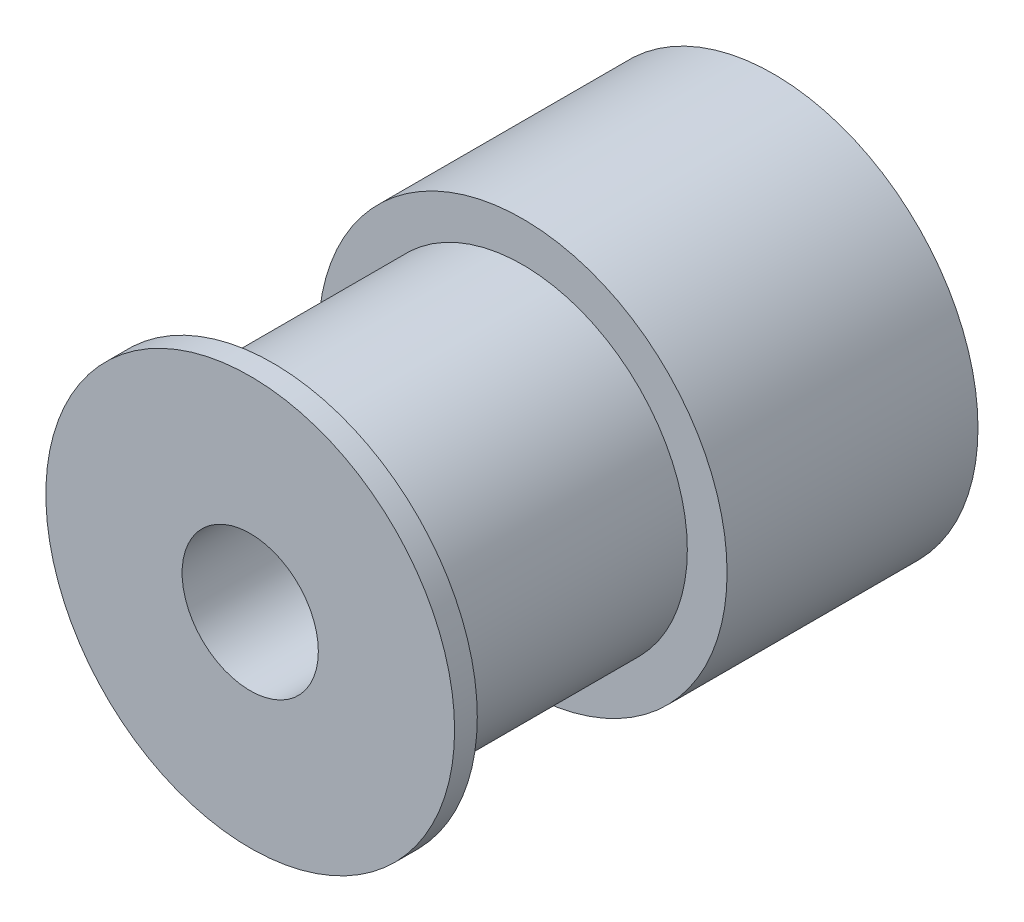
ISO-10303-21;
HEADER;
FILE_DESCRIPTION(('STEP AP214'),'2;1');
FILE_NAME('part.step','',(''),(''),'','','');
FILE_SCHEMA(('AUTOMOTIVE_DESIGN { 1 0 10303 214 1 1 1 1 }'));
ENDSEC;
DATA;
#1=APPLICATION_CONTEXT('core data for automotive mechanical design processes');
#2=APPLICATION_PROTOCOL_DEFINITION('international standard','automotive_design',2000,#1);
#3=PRODUCT_CONTEXT('',#1,'mechanical');
#4=PRODUCT('Part','Part','',(#3));
#5=PRODUCT_RELATED_PRODUCT_CATEGORY('part','',(#4));
#6=PRODUCT_DEFINITION_FORMATION('','',#4);
#7=PRODUCT_DEFINITION_CONTEXT('part definition',#1,'design');
#8=PRODUCT_DEFINITION('design','',#6,#7);
#9=PRODUCT_DEFINITION_SHAPE('','',#8);
#10=(LENGTH_UNIT() NAMED_UNIT(*) SI_UNIT(.MILLI.,.METRE.));
#11=(NAMED_UNIT(*) PLANE_ANGLE_UNIT() SI_UNIT($,.RADIAN.));
#12=(NAMED_UNIT(*) SI_UNIT($,.STERADIAN.) SOLID_ANGLE_UNIT());
#13=UNCERTAINTY_MEASURE_WITH_UNIT(LENGTH_MEASURE(1.E-05),#10,'distance_accuracy_value','');
#14=(GEOMETRIC_REPRESENTATION_CONTEXT(3) GLOBAL_UNCERTAINTY_ASSIGNED_CONTEXT((#13)) GLOBAL_UNIT_ASSIGNED_CONTEXT((#10,
#11,#12)) REPRESENTATION_CONTEXT('',''));
#15=CARTESIAN_POINT('',(0.,0.,0.));
#16=DIRECTION('',(0.,0.,1.));
#17=DIRECTION('',(1.,0.,0.));
#18=AXIS2_PLACEMENT_3D('',#15,#16,#17);
#19=CARTESIAN_POINT('',(-7.6576224925767E-07,0.0303759794272524,10.7364688875642));
#20=DIRECTION('',(0.,0.,1.));
#21=DIRECTION('',(1.,0.,0.));
#22=AXIS2_PLACEMENT_3D('',#19,#20,#21);
#23=PLANE('',#22);
#24=CARTESIAN_POINT('',(-7.6576224925767E-07,0.0303759794272524,10.7364688875642));
#25=DIRECTION('',(0.,0.,1.));
#26=DIRECTION('',(1.,0.,0.));
#27=AXIS2_PLACEMENT_3D('',#24,#25,#26);
#28=CIRCLE('',#27,3.625);
#29=CARTESIAN_POINT('',(3.62499923423775,0.0303759794272524,10.7364688875642));
#30=VERTEX_POINT('',#29);
#31=EDGE_CURVE('E12',#30,#30,#28,.T.);
#32=ORIENTED_EDGE('',*,*,#31,.F.);
#33=EDGE_LOOP('',(#32));
#34=FACE_BOUND('',#33,.T.);
#35=CARTESIAN_POINT('',(-7.6576224925767E-07,0.0303759794272524,10.7364688875642));
#36=DIRECTION('',(0.,0.,1.));
#37=DIRECTION('',(1.,0.,0.));
#38=AXIS2_PLACEMENT_3D('',#35,#36,#37);
#39=CIRCLE('',#38,4.5);
#40=CARTESIAN_POINT('',(4.49999923423775,0.0303759794272524,10.7364688875642));
#41=VERTEX_POINT('',#40);
#42=EDGE_CURVE('E59',#41,#41,#39,.T.);
#43=ORIENTED_EDGE('',*,*,#42,.T.);
#44=EDGE_LOOP('',(#43));
#45=FACE_BOUND('',#44,.T.);
#46=ADVANCED_FACE('F45',(#34,#45),#23,.T.);
#47=CARTESIAN_POINT('',(-7.6576224925767E-07,0.0303759794272524,5.21146888756417));
#48=DIRECTION('',(0.,0.,1.));
#49=DIRECTION('',(1.,0.,0.));
#50=AXIS2_PLACEMENT_3D('',#47,#48,#49);
#51=PLANE('',#50);
#52=CARTESIAN_POINT('',(-7.6576224925767E-07,0.0303759794272524,5.21146888756417));
#53=DIRECTION('',(0.,0.,1.));
#54=DIRECTION('',(1.,0.,0.));
#55=AXIS2_PLACEMENT_3D('',#52,#53,#54);
#56=CIRCLE('',#55,4.5);
#57=CARTESIAN_POINT('',(4.49999923423775,0.0303759794272524,5.21146888756417));
#58=VERTEX_POINT('',#57);
#59=EDGE_CURVE('E64',#58,#58,#56,.T.);
#60=ORIENTED_EDGE('',*,*,#59,.F.);
#61=EDGE_LOOP('',(#60));
#62=FACE_BOUND('',#61,.T.);
#63=CARTESIAN_POINT('',(-7.6576224925767E-07,0.0303759794272524,5.21146888756417));
#64=DIRECTION('',(0.,0.,1.));
#65=DIRECTION('',(1.,0.,0.));
#66=AXIS2_PLACEMENT_3D('',#63,#64,#65);
#67=CIRCLE('',#66,1.5);
#68=CARTESIAN_POINT('',(1.49999923423775,0.0303759794272524,5.21146888756417));
#69=VERTEX_POINT('',#68);
#70=EDGE_CURVE('E70',#69,#69,#67,.T.);
#71=ORIENTED_EDGE('',*,*,#70,.T.);
#72=EDGE_LOOP('',(#71));
#73=FACE_BOUND('',#72,.T.);
#74=ADVANCED_FACE('F76',(#62,#73),#51,.F.);
#75=CARTESIAN_POINT('',(-7.6576224925767E-07,0.0303759794272524,10.7364688875642));
#76=DIRECTION('',(0.,0.,-1.));
#77=DIRECTION('',(-1.,0.,0.));
#78=AXIS2_PLACEMENT_3D('',#75,#76,#77);
#79=CYLINDRICAL_SURFACE('',#78,4.5);
#80=CARTESIAN_POINT('',(-7.6576224925767E-07,-4.46962402057275,7.96146888756417));
#81=CARTESIAN_POINT('',(0.0418165057252151,-4.46962330407922,7.96146721087982));
#82=CARTESIAN_POINT('',(0.0836565987893969,-4.46903505431185,7.95795970507349));
#83=CARTESIAN_POINT('',(0.166163300739664,-4.46674505539691,7.94402818993457));
#84=CARTESIAN_POINT('',(0.206828794625525,-4.46504228234442,7.93359782049068));
#85=CARTESIAN_POINT('',(0.285780658401544,-4.4607142252821,7.90614425298634));
#86=CARTESIAN_POINT('',(0.324068944767321,-4.45808969605033,7.88912644787199));
#87=CARTESIAN_POINT('',(0.397241786831134,-4.45220670181896,7.84899519994845));
#88=CARTESIAN_POINT('',(0.432126731201328,-4.44894830933605,7.82588245431927));
#89=CARTESIAN_POINT('',(0.497841018525255,-4.44212397294769,7.77398236241803));
#90=CARTESIAN_POINT('',(0.528633105298241,-4.43855563601732,7.74514815317333));
#91=CARTESIAN_POINT('',(0.584965783835729,-4.43153190120294,7.68272449702232));
#92=CARTESIAN_POINT('',(0.610506044055042,-4.42807651046075,7.64913475012718));
#93=CARTESIAN_POINT('',(0.655759371919291,-4.42164671785209,7.57789759770505));
#94=CARTESIAN_POINT('',(0.675435600096051,-4.41867540784766,7.54022648652274));
#95=CARTESIAN_POINT('',(0.708166743861116,-4.41358338995677,7.46205601827398));
#96=CARTESIAN_POINT('',(0.721222106707435,-4.41146262461567,7.42155685246088));
#97=CARTESIAN_POINT('',(0.740223547573193,-4.40833563110101,7.33927480510721));
#98=CARTESIAN_POINT('',(0.746233942978371,-4.40731932602985,7.29750716661375));
#99=CARTESIAN_POINT('',(0.751174251824713,-4.4064858373827,7.21354480449913));
#100=CARTESIAN_POINT('',(0.75010466635445,-4.40666856894439,7.17135011131398));
#101=CARTESIAN_POINT('',(0.740967763756596,-4.40820330716341,7.08819052918153));
#102=CARTESIAN_POINT('',(0.732972698804683,-4.4095432405295,7.0472174465006));
#103=CARTESIAN_POINT('',(0.710325176358784,-4.41322250620577,6.96720249221543));
#104=CARTESIAN_POINT('',(0.695672490533673,-4.41556187279256,6.9281606868976));
#105=CARTESIAN_POINT('',(0.660052408065924,-4.42098945857505,6.85290024053189));
#106=CARTESIAN_POINT('',(0.639055008401665,-4.42408122189472,6.8166960657398));
#107=CARTESIAN_POINT('',(0.591362839504981,-4.43066277581777,6.74829756740265));
#108=CARTESIAN_POINT('',(0.564667610434037,-4.43415259853561,6.71610356782769));
#109=CARTESIAN_POINT('',(0.505943897885467,-4.4411901042121,6.65622106182196));
#110=CARTESIAN_POINT('',(0.473853423399689,-4.4447379682677,6.62859333200214));
#111=CARTESIAN_POINT('',(0.405459808932244,-4.45145182476292,6.57910555876456));
#112=CARTESIAN_POINT('',(0.369156641809677,-4.45461781474198,6.5572455525092));
#113=CARTESIAN_POINT('',(0.293311009087764,-4.46021569925148,6.51990821942328));
#114=CARTESIAN_POINT('',(0.253765851907149,-4.46264697579509,6.50443626176479));
#115=CARTESIAN_POINT('',(0.17258873791857,-4.46649652961073,6.48037062299037));
#116=CARTESIAN_POINT('',(0.130956955991591,-4.46791489162417,6.47177636647205));
#117=CARTESIAN_POINT('',(0.0473122046282373,-4.46956741010081,6.46179248002583));
#118=CARTESIAN_POINT('',(0.00530945538305355,-4.4698152796111,6.46031941602249));
#119=CARTESIAN_POINT('',(-0.078342697629216,-4.46913644383626,6.4643972908926));
#120=CARTESIAN_POINT('',(-0.119992114929861,-4.4682097837451,6.46994795950429));
#121=CARTESIAN_POINT('',(-0.201497618426279,-4.46529450138735,6.48784634236481));
#122=CARTESIAN_POINT('',(-0.241363026277864,-4.46331233497668,6.5001527500812));
#123=CARTESIAN_POINT('',(-0.318464831220383,-4.45850741393882,6.53116924302403));
#124=CARTESIAN_POINT('',(-0.355701080535165,-4.45568461210881,6.54987968785475));
#125=CARTESIAN_POINT('',(-0.426849972602937,-4.44947756947997,6.5933642249732));
#126=CARTESIAN_POINT('',(-0.460730341043394,-4.44608858823381,6.61819043441434));
#127=CARTESIAN_POINT('',(-0.523873841413056,-4.43913942274845,6.67313008217968));
#128=CARTESIAN_POINT('',(-0.553136637671225,-4.43557922608739,6.70324390454717));
#129=CARTESIAN_POINT('',(-0.60652359965965,-4.42864454628028,6.76827815198559));
#130=CARTESIAN_POINT('',(-0.630591394096364,-4.42527236898407,6.80324513721849));
#131=CARTESIAN_POINT('',(-0.672511458850745,-4.4191386099064,6.87677477830573));
#132=CARTESIAN_POINT('',(-0.690363926193196,-4.41637700877081,6.91533732013242));
#133=CARTESIAN_POINT('',(-0.719262265204194,-4.41179438166586,6.99480580740781));
#134=CARTESIAN_POINT('',(-0.730336195526633,-4.40996948350594,7.03570131607332));
#135=CARTESIAN_POINT('',(-0.745451401895733,-4.40745717107853,7.1188049263307));
#136=CARTESIAN_POINT('',(-0.7494932893461,-4.40676965792091,7.16101291348378));
#137=CARTESIAN_POINT('',(-0.750412625576455,-4.40661421982478,7.24498043735289));
#138=CARTESIAN_POINT('',(-0.747378806599805,-4.4071311900897,7.28673900113675));
#139=CARTESIAN_POINT('',(-0.734424717449304,-4.40929336493393,7.3691426619794));
#140=CARTESIAN_POINT('',(-0.724504469595992,-4.41093856585639,7.40978776264673));
#141=CARTESIAN_POINT('',(-0.698093112640719,-4.4151660894179,7.48877641875195));
#142=CARTESIAN_POINT('',(-0.681609642942382,-4.41774732223176,7.52712259058097));
#143=CARTESIAN_POINT('',(-0.642548866937022,-4.42355712733937,7.60051958832262));
#144=CARTESIAN_POINT('',(-0.619971258386818,-4.42678573173795,7.63557025067581));
#145=CARTESIAN_POINT('',(-0.569046431073895,-4.43357438270961,7.70182956249649));
#146=CARTESIAN_POINT('',(-0.540633934840343,-4.43713790730166,7.73298769257425));
#147=CARTESIAN_POINT('',(-0.478983475176317,-4.44416713765527,7.79012436890665));
#148=CARTESIAN_POINT('',(-0.44574439963604,-4.44763282065239,7.81610171815562));
#149=CARTESIAN_POINT('',(-0.375111516654333,-4.45410360949941,7.86230336802415));
#150=CARTESIAN_POINT('',(-0.337690602022094,-4.45710536933206,7.88248669935805));
#151=CARTESIAN_POINT('',(-0.259954686575943,-4.46227752337807,7.91624973294714));
#152=CARTESIAN_POINT('',(-0.219642614211252,-4.46444874510519,7.92983601188808));
#153=CARTESIAN_POINT('',(-0.149311758775869,-4.46724139307161,7.94707046980217));
#154=CARTESIAN_POINT('',(-0.119718414851783,-4.46813010239282,7.95246122844896));
#155=CARTESIAN_POINT('',(-0.0600875588581919,-4.46932166853111,7.95966100891759));
#156=CARTESIAN_POINT('',(-0.0300500544447975,-4.46962453543467,7.96147009240538));
#157=CARTESIAN_POINT('',(-7.6576224925767E-07,-4.46962402057275,7.96146888756417));
#158=B_SPLINE_CURVE_WITH_KNOTS('',3,(#80,#81,#82,#83,#84,#85,#86,#87,#88,#89,#90,#91,#92,#93,
#94,#95,#96,#97,#98,#99,#100,#101,#102,#103,#104,#105,#106,#107,#108,#109,#110,#111,#112,#113,
#114,#115,#116,#117,#118,#119,#120,#121,#122,#123,#124,#125,#126,#127,#128,#129,#130,#131,#132,
#133,#134,#135,#136,#137,#138,#139,#140,#141,#142,#143,#144,#145,#146,#147,#148,#149,#150,#151,
#152,#153,#154,#155,#156,#157),.UNSPECIFIED.,.T.,.F.,(4,2,2,2,2,2,2,2,2,2,2,2,2,2,2,2,2,2,2,2,2,
2,2,2,2,2,2,2,2,2,2,2,2,2,2,2,2,2,4),(0.,0.125341975481553,0.250799263708626,0.376154060107581,
0.501494523802437,0.627907473186997,0.75432840050957,0.88152756247152,1.00871813062854,
1.13473823131027,1.26074941296266,1.38546156528123,1.51017799507614,1.63549366989767,
1.76081946204172,1.88769830973398,2.01457797490754,2.14156406674771,2.26853953356345,
2.39402365047419,2.51950293910758,2.64422342101925,2.7689509074782,2.89478047688107,
3.02061918916285,3.14776146602286,3.27489971212783,3.40150806702532,3.52810541335985,
3.6531237285681,3.7781416385644,3.90301445467867,4.02789346508801,4.15425415258018,
4.28064400163692,4.4079066948216,4.53504225639022,4.62511274449205,4.7151816818309),.UNSPECIFIED.);
#159=CARTESIAN_POINT('',(-7.6576224925767E-07,-4.46962402057275,7.96146888756417));
#160=VERTEX_POINT('',#159);
#161=EDGE_CURVE('E91',#160,#160,#158,.T.);
#162=ORIENTED_EDGE('',*,*,#161,.T.);
#163=EDGE_LOOP('',(#162));
#164=FACE_BOUND('',#163,.T.);
#165=ORIENTED_EDGE('',*,*,#42,.F.);
#166=EDGE_LOOP('',(#165));
#167=FACE_BOUND('',#166,.T.);
#168=ORIENTED_EDGE('',*,*,#59,.T.);
#169=EDGE_LOOP('',(#168));
#170=FACE_BOUND('',#169,.T.);
#171=ADVANCED_FACE('F47',(#164,#167,#170),#79,.T.);
#172=CARTESIAN_POINT('',(-7.6576224925767E-07,0.0303759794272524,10.7364688875642));
#173=DIRECTION('',(0.,0.,-1.));
#174=DIRECTION('',(-1.,0.,0.));
#175=AXIS2_PLACEMENT_3D('',#172,#173,#174);
#176=CYLINDRICAL_SURFACE('',#175,1.5);
#177=CARTESIAN_POINT('',(-7.6576224925767E-07,-1.46962402057275,7.96146888756417));
#178=CARTESIAN_POINT('',(0.0394282064524905,-1.46962187110388,7.96146641082454));
#179=CARTESIAN_POINT('',(0.078904184011275,-1.46805270321913,7.95834133272291));
#180=CARTESIAN_POINT('',(0.156689410689069,-1.46193019085322,7.94597922730848));
#181=CARTESIAN_POINT('',(0.194996299272878,-1.45737117929012,7.93673059281593));
#182=CARTESIAN_POINT('',(0.269199392898182,-1.44574611609758,7.91257353110157));
#183=CARTESIAN_POINT('',(0.305104336442136,-1.43868981440415,7.89768709937816));
#184=CARTESIAN_POINT('',(0.373853696842675,-1.42271734444109,7.86279092154046));
#185=CARTESIAN_POINT('',(0.406698354730288,-1.41380132282422,7.84278157937753));
#186=CARTESIAN_POINT('',(0.47063009755919,-1.39429595750818,7.79683095045019));
#187=CARTESIAN_POINT('',(0.501490642579335,-1.38363801402927,7.77060402813443));
#188=CARTESIAN_POINT('',(0.558583817887984,-1.36207379742333,7.71357777812889));
#189=CARTESIAN_POINT('',(0.584812921567825,-1.35116734214051,7.68277499873484));
#190=CARTESIAN_POINT('',(0.633938234575459,-1.32936615455285,7.61460637542163));
#191=CARTESIAN_POINT('',(0.656418235901478,-1.31853792284874,7.57691681380473));
#192=CARTESIAN_POINT('',(0.694625404405772,-1.29926886136515,7.49769338557451));
#193=CARTESIAN_POINT('',(0.710357395462501,-1.29082632762517,7.45616229102211));
#194=CARTESIAN_POINT('',(0.733598565879192,-1.27805802335631,7.37297005849773));
#195=CARTESIAN_POINT('',(0.741543627048081,-1.2735160574506,7.33146554851362));
#196=CARTESIAN_POINT('',(0.750319479219385,-1.26848819518671,7.24748475922956));
#197=CARTESIAN_POINT('',(0.751157300517556,-1.26799829064741,7.2050094819108));
#198=CARTESIAN_POINT('',(0.746014699616972,-1.27095599750211,7.12575436932764));
#199=CARTESIAN_POINT('',(0.740837653890367,-1.27393974803785,7.08890086414688));
#200=CARTESIAN_POINT('',(0.72520412103045,-1.28269573607662,7.01667745553438));
#201=CARTESIAN_POINT('',(0.714745952160989,-1.28846886181107,6.98130802858518));
#202=CARTESIAN_POINT('',(0.688656569527253,-1.30228009366831,6.91204703813992));
#203=CARTESIAN_POINT('',(0.672910534574747,-1.31036782555274,6.87820908847483));
#204=CARTESIAN_POINT('',(0.636780499988752,-1.32789955268328,6.81349316812166));
#205=CARTESIAN_POINT('',(0.616394417097101,-1.33734415642418,6.7826165358641));
#206=CARTESIAN_POINT('',(0.568548775422342,-1.35797270484739,6.72057794800675));
#207=CARTESIAN_POINT('',(0.540520078014712,-1.36922534734834,6.68987623238205));
#208=CARTESIAN_POINT('',(0.479665918293781,-1.3912311953258,6.63341732362099));
#209=CARTESIAN_POINT('',(0.446838176668465,-1.40198416026375,6.60766249353876));
#210=CARTESIAN_POINT('',(0.375386613611637,-1.42238892519498,6.56070464179187));
#211=CARTESIAN_POINT('',(0.336564427937307,-1.4319664017878,6.53976853322986));
#212=CARTESIAN_POINT('',(0.255348895854349,-1.44830812898206,6.50489611578191));
#213=CARTESIAN_POINT('',(0.212958416436708,-1.45507461264939,6.49095424880279));
#214=CARTESIAN_POINT('',(0.129574102983277,-1.46455652363352,6.47161233477666));
#215=CARTESIAN_POINT('',(0.0887553821489938,-1.46756105783259,6.46560046075408));
#216=CARTESIAN_POINT('',(0.00658393419976601,-1.47017162151601,6.4603703392133));
#217=CARTESIAN_POINT('',(-0.0347685306646752,-1.46977926098259,6.46114887333456));
#218=CARTESIAN_POINT('',(-0.113425494751744,-1.46580796247355,6.46912390387823));
#219=CARTESIAN_POINT('',(-0.150795321799715,-1.46247836323417,6.47581828711169));
#220=CARTESIAN_POINT('',(-0.223805934988687,-1.45329030543389,6.49464744148548));
#221=CARTESIAN_POINT('',(-0.259446530030497,-1.44743156808024,6.50678281240419));
#222=CARTESIAN_POINT('',(-0.329167222099498,-1.43350590617527,6.53646773738905));
#223=CARTESIAN_POINT('',(-0.363173563516865,-1.42538063384729,6.55416217515178));
#224=CARTESIAN_POINT('',(-0.42784678703644,-1.40770382795107,6.5942995392987));
#225=CARTESIAN_POINT('',(-0.458512238093711,-1.39815168731614,6.61674448850924));
#226=CARTESIAN_POINT('',(-0.518826532730239,-1.37743568060373,6.66828920656382));
#227=CARTESIAN_POINT('',(-0.548079824130729,-1.36620565693606,6.69782603890434));
#228=CARTESIAN_POINT('',(-0.601393006597179,-1.34409195760181,6.76141275101614));
#229=CARTESIAN_POINT('',(-0.62544930503038,-1.3332085259342,6.79546572667645));
#230=CARTESIAN_POINT('',(-0.668781701635521,-1.31250796226826,6.8692016282144));
#231=CARTESIAN_POINT('',(-0.687769887671227,-1.30276799304879,6.90907733722061));
#232=CARTESIAN_POINT('',(-0.718562885272602,-1.28642956333369,6.99210143833356));
#233=CARTESIAN_POINT('',(-0.730376952677927,-1.27982705737738,7.03524553244006));
#234=CARTESIAN_POINT('',(-0.745397031349508,-1.27133527813775,7.11915155471025));
#235=CARTESIAN_POINT('',(-0.749320513062898,-1.26905439652643,7.15974457763594));
#236=CARTESIAN_POINT('',(-0.750517631547839,-1.26836418041906,7.24105418794221));
#237=CARTESIAN_POINT('',(-0.747794150730548,-1.26995316777939,7.28177071411874));
#238=CARTESIAN_POINT('',(-0.736445359956447,-1.27640798594793,7.35808151371318));
#239=CARTESIAN_POINT('',(-0.728407001519349,-1.2809472291907,7.39379424017247));
#240=CARTESIAN_POINT('',(-0.707382284430733,-1.29240664198213,7.4633249771327));
#241=CARTESIAN_POINT('',(-0.694394334132107,-1.29932757734531,7.49714237413314));
#242=CARTESIAN_POINT('',(-0.662862574737762,-1.31533799830671,7.56443752580412));
#243=CARTESIAN_POINT('',(-0.644004119124593,-1.32454193854418,7.59773981393644));
#244=CARTESIAN_POINT('',(-0.601613994489725,-1.34388900783217,7.66092478969961));
#245=CARTESIAN_POINT('',(-0.578079894191236,-1.35403262403166,7.69080568545303));
#246=CARTESIAN_POINT('',(-0.52365326076073,-1.3755914442676,7.75007537433238));
#247=CARTESIAN_POINT('',(-0.492214083019878,-1.38701139540876,7.77896321433561));
#248=CARTESIAN_POINT('',(-0.424616870427459,-1.40870716248591,7.83116612513189));
#249=CARTESIAN_POINT('',(-0.388456308204838,-1.41898236013305,7.85447819213388));
#250=CARTESIAN_POINT('',(-0.311949463377209,-1.43735909246102,7.89489615963582));
#251=CARTESIAN_POINT('',(-0.27157539371321,-1.44544474479456,7.91195701462274));
#252=CARTESIAN_POINT('',(-0.188057341732893,-1.45838408079874,7.93882501350338));
#253=CARTESIAN_POINT('',(-0.144921615479624,-1.46324694586974,7.94865277268635));
#254=CARTESIAN_POINT('',(-0.084452225624787,-1.46733998489522,7.95689194587105));
#255=CARTESIAN_POINT('',(-0.0676221753418734,-1.46819426061676,7.95860586821188));
#256=CARTESIAN_POINT('',(-0.0338645646176177,-1.46933674790673,7.96089488670177));
#257=CARTESIAN_POINT('',(-0.0169370014977854,-1.46962494385097,7.96146995141757));
#258=CARTESIAN_POINT('',(-7.6576224925767E-07,-1.46962402057275,7.96146888756417));
#259=B_SPLINE_CURVE_WITH_KNOTS('',3,(#177,#178,#179,#180,#181,#182,#183,#184,#185,#186,#187,
#188,#189,#190,#191,#192,#193,#194,#195,#196,#197,#198,#199,#200,#201,#202,#203,#204,#205,#206,
#207,#208,#209,#210,#211,#212,#213,#214,#215,#216,#217,#218,#219,#220,#221,#222,#223,#224,#225,
#226,#227,#228,#229,#230,#231,#232,#233,#234,#235,#236,#237,#238,#239,#240,#241,#242,#243,#244,
#245,#246,#247,#248,#249,#250,#251,#252,#253,#254,#255,#256,#257,#258),.UNSPECIFIED.,.T.,.F.,(4,
2,2,2,2,2,2,2,2,2,2,2,2,2,2,2,2,2,2,2,2,2,2,2,2,2,2,2,2,2,2,2,2,2,2,2,2,2,2,2,4),(0.,
0.118218193065219,0.236661112281898,0.354646616619225,0.472622820436176,0.597736319038567,
0.722944678240526,0.857862948230644,0.992684609237106,1.11943509105172,1.24606017996765,
1.3575428430699,1.46906102944259,1.58317680126366,1.69734390945166,1.82598706000409,
1.95469150949015,2.0893726666083,2.2239466268421,2.34737467853509,2.47074423383607,
2.58455179879591,2.69837191223199,2.81544642020924,2.93257088061254,3.06119707983314,
3.18991191461574,3.32486011619755,3.45963383955583,3.5814698062378,3.70325294895004,
3.81343447683137,3.92365146587758,4.0412734258171,4.15895670854218,4.29093932064374,
4.42299287532429,4.55598010247194,4.68858681468697,4.73936460103273,4.79014378886135),.UNSPECIFIED.);
#260=CARTESIAN_POINT('',(-7.6576224925767E-07,-1.46962402057275,7.96146888756417));
#261=VERTEX_POINT('',#260);
#262=EDGE_CURVE('E50',#261,#261,#259,.T.);
#263=ORIENTED_EDGE('',*,*,#262,.F.);
#264=EDGE_LOOP('',(#263));
#265=FACE_BOUND('',#264,.T.);
#266=ORIENTED_EDGE('',*,*,#70,.F.);
#267=EDGE_LOOP('',(#266));
#268=FACE_BOUND('',#267,.T.);
#269=CARTESIAN_POINT('',(-7.6576224925767E-07,0.0303759794272524,16.7364688875642));
#270=DIRECTION('',(0.,0.,1.));
#271=DIRECTION('',(1.,0.,0.));
#272=AXIS2_PLACEMENT_3D('',#269,#270,#271);
#273=CIRCLE('',#272,1.5);
#274=CARTESIAN_POINT('',(1.49999923423775,0.0303759794272524,16.7364688875642));
#275=VERTEX_POINT('',#274);
#276=EDGE_CURVE('E88',#275,#275,#273,.T.);
#277=ORIENTED_EDGE('',*,*,#276,.T.);
#278=EDGE_LOOP('',(#277));
#279=FACE_BOUND('',#278,.T.);
#280=ADVANCED_FACE('F81',(#265,#268,#279),#176,.F.);
#281=CARTESIAN_POINT('',(-7.6576224925767E-07,0.0303759794272524,16.2364688875642));
#282=DIRECTION('',(0.,0.,-1.));
#283=DIRECTION('',(-1.,0.,0.));
#284=AXIS2_PLACEMENT_3D('',#281,#282,#283);
#285=CYLINDRICAL_SURFACE('',#284,3.625);
#286=CARTESIAN_POINT('',(-7.6576224925767E-07,0.0303759794272524,16.2364688875642));
#287=DIRECTION('',(0.,0.,1.));
#288=DIRECTION('',(1.,0.,0.));
#289=AXIS2_PLACEMENT_3D('',#286,#287,#288);
#290=CIRCLE('',#289,3.625);
#291=CARTESIAN_POINT('',(3.62499923423775,0.0303759794272524,16.2364688875642));
#292=VERTEX_POINT('',#291);
#293=EDGE_CURVE('E68',#292,#292,#290,.T.);
#294=ORIENTED_EDGE('',*,*,#293,.F.);
#295=EDGE_LOOP('',(#294));
#296=FACE_BOUND('',#295,.T.);
#297=ORIENTED_EDGE('',*,*,#31,.T.);
#298=EDGE_LOOP('',(#297));
#299=FACE_BOUND('',#298,.T.);
#300=ADVANCED_FACE('F84',(#296,#299),#285,.T.);
#301=CARTESIAN_POINT('',(-7.6576224925767E-07,0.0303759794272524,16.7364688875642));
#302=DIRECTION('',(0.,0.,1.));
#303=DIRECTION('',(1.,0.,0.));
#304=AXIS2_PLACEMENT_3D('',#301,#302,#303);
#305=PLANE('',#304);
#306=CARTESIAN_POINT('',(-7.6576224925767E-07,0.0303759794272524,16.7364688875642));
#307=DIRECTION('',(0.,0.,1.));
#308=DIRECTION('',(1.,0.,0.));
#309=AXIS2_PLACEMENT_3D('',#306,#307,#308);
#310=CIRCLE('',#309,4.5);
#311=CARTESIAN_POINT('',(4.49999923423775,0.0303759794272524,16.7364688875642));
#312=VERTEX_POINT('',#311);
#313=EDGE_CURVE('E94',#312,#312,#310,.T.);
#314=ORIENTED_EDGE('',*,*,#313,.T.);
#315=EDGE_LOOP('',(#314));
#316=FACE_BOUND('',#315,.T.);
#317=ORIENTED_EDGE('',*,*,#276,.F.);
#318=EDGE_LOOP('',(#317));
#319=FACE_BOUND('',#318,.T.);
#320=ADVANCED_FACE('F111',(#316,#319),#305,.T.);
#321=CARTESIAN_POINT('',(-7.6576224925767E-07,0.0303759794272524,16.2364688875642));
#322=DIRECTION('',(0.,0.,1.));
#323=DIRECTION('',(1.,0.,0.));
#324=AXIS2_PLACEMENT_3D('',#321,#322,#323);
#325=PLANE('',#324);
#326=ORIENTED_EDGE('',*,*,#293,.T.);
#327=EDGE_LOOP('',(#326));
#328=FACE_BOUND('',#327,.T.);
#329=CARTESIAN_POINT('',(-7.6576224925767E-07,0.0303759794272524,16.2364688875642));
#330=DIRECTION('',(0.,0.,1.));
#331=DIRECTION('',(1.,0.,0.));
#332=AXIS2_PLACEMENT_3D('',#329,#330,#331);
#333=CIRCLE('',#332,4.5);
#334=CARTESIAN_POINT('',(4.49999923423775,0.0303759794272524,16.2364688875642));
#335=VERTEX_POINT('',#334);
#336=EDGE_CURVE('E90',#335,#335,#333,.T.);
#337=ORIENTED_EDGE('',*,*,#336,.F.);
#338=EDGE_LOOP('',(#337));
#339=FACE_BOUND('',#338,.T.);
#340=ADVANCED_FACE('F107',(#328,#339),#325,.F.);
#341=CARTESIAN_POINT('',(-7.6576224925767E-07,0.0303759794272524,16.7364688875642));
#342=DIRECTION('',(0.,0.,-1.));
#343=DIRECTION('',(-1.,0.,0.));
#344=AXIS2_PLACEMENT_3D('',#341,#342,#343);
#345=CYLINDRICAL_SURFACE('',#344,4.5);
#346=ORIENTED_EDGE('',*,*,#313,.F.);
#347=EDGE_LOOP('',(#346));
#348=FACE_BOUND('',#347,.T.);
#349=ORIENTED_EDGE('',*,*,#336,.T.);
#350=EDGE_LOOP('',(#349));
#351=FACE_BOUND('',#350,.T.);
#352=ADVANCED_FACE('F135',(#348,#351),#345,.T.);
#353=CARTESIAN_POINT('',(-7.6576224925767E-07,-4.46962402057275,7.21146888756417));
#354=DIRECTION('',(0.,1.,0.));
#355=DIRECTION('',(0.,0.,1.));
#356=AXIS2_PLACEMENT_3D('',#353,#354,#355);
#357=CYLINDRICAL_SURFACE('',#356,0.75);
#358=ORIENTED_EDGE('',*,*,#262,.T.);
#359=EDGE_LOOP('',(#358));
#360=FACE_BOUND('',#359,.T.);
#361=ORIENTED_EDGE('',*,*,#161,.F.);
#362=EDGE_LOOP('',(#361));
#363=FACE_BOUND('',#362,.T.);
#364=ADVANCED_FACE('F133',(#360,#363),#357,.F.);
#365=CLOSED_SHELL('',(#46,#74,#171,#280,#300,#320,#340,#352,#364));
#366=MANIFOLD_SOLID_BREP('B2',#365);
#367=ADVANCED_BREP_SHAPE_REPRESENTATION('',(#18,#366),#14);
#368=SHAPE_DEFINITION_REPRESENTATION(#9,#367);
ENDSEC;
END-ISO-10303-21;
